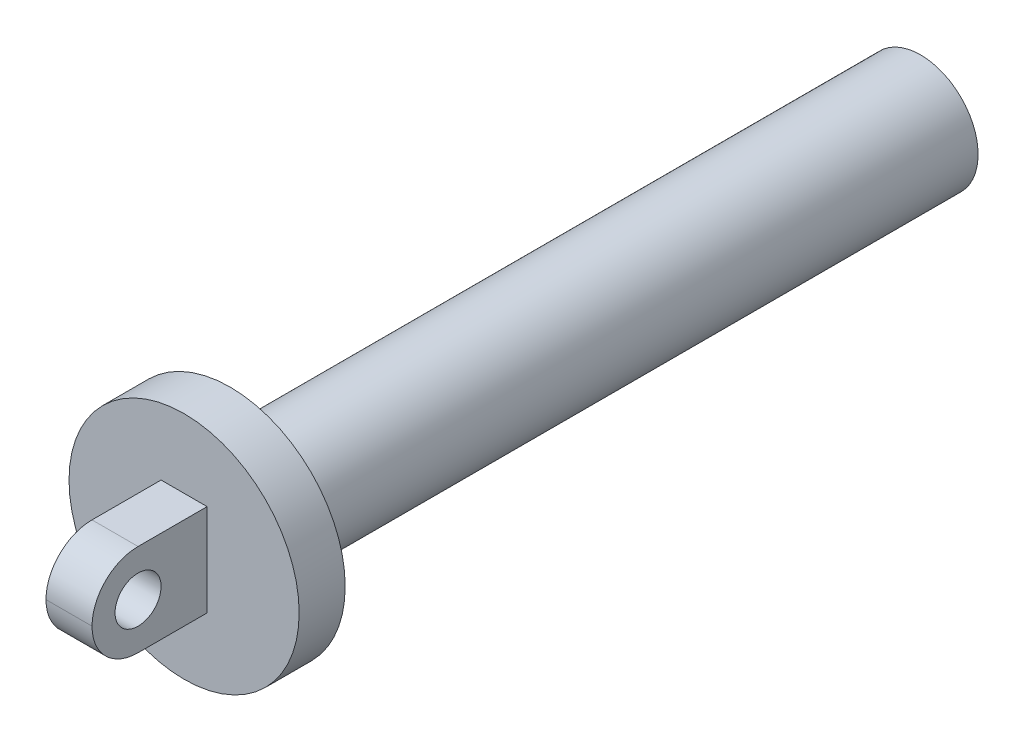
ISO-10303-21;
HEADER;
FILE_DESCRIPTION(('STEP AP214'),'2;1');
FILE_NAME('part.step','',(''),(''),'','','');
FILE_SCHEMA(('AUTOMOTIVE_DESIGN { 1 0 10303 214 1 1 1 1 }'));
ENDSEC;
DATA;
#1=APPLICATION_CONTEXT('core data for automotive mechanical design processes');
#2=APPLICATION_PROTOCOL_DEFINITION('international standard','automotive_design',2000,#1);
#3=PRODUCT_CONTEXT('',#1,'mechanical');
#4=PRODUCT('Part','Part','',(#3));
#5=PRODUCT_RELATED_PRODUCT_CATEGORY('part','',(#4));
#6=PRODUCT_DEFINITION_FORMATION('','',#4);
#7=PRODUCT_DEFINITION_CONTEXT('part definition',#1,'design');
#8=PRODUCT_DEFINITION('design','',#6,#7);
#9=PRODUCT_DEFINITION_SHAPE('','',#8);
#10=(LENGTH_UNIT() NAMED_UNIT(*) SI_UNIT(.MILLI.,.METRE.));
#11=(NAMED_UNIT(*) PLANE_ANGLE_UNIT() SI_UNIT($,.RADIAN.));
#12=(NAMED_UNIT(*) SI_UNIT($,.STERADIAN.) SOLID_ANGLE_UNIT());
#13=UNCERTAINTY_MEASURE_WITH_UNIT(LENGTH_MEASURE(1.E-05),#10,'distance_accuracy_value','');
#14=(GEOMETRIC_REPRESENTATION_CONTEXT(3) GLOBAL_UNCERTAINTY_ASSIGNED_CONTEXT((#13)) GLOBAL_UNIT_ASSIGNED_CONTEXT((#10,
#11,#12)) REPRESENTATION_CONTEXT('',''));
#15=CARTESIAN_POINT('',(0.,0.,0.));
#16=DIRECTION('',(0.,0.,1.));
#17=DIRECTION('',(1.,0.,0.));
#18=AXIS2_PLACEMENT_3D('',#15,#16,#17);
#19=CARTESIAN_POINT('',(0.,0.,10.));
#20=DIRECTION('',(0.,0.,-1.));
#21=DIRECTION('',(-1.,0.,0.));
#22=AXIS2_PLACEMENT_3D('',#19,#20,#21);
#23=CYLINDRICAL_SURFACE('',#22,25.);
#24=CARTESIAN_POINT('',(0.,0.,10.));
#25=DIRECTION('',(0.,0.,1.));
#26=DIRECTION('',(1.,0.,0.));
#27=AXIS2_PLACEMENT_3D('',#24,#25,#26);
#28=CIRCLE('',#27,25.);
#29=CARTESIAN_POINT('',(25.,0.,10.));
#30=VERTEX_POINT('',#29);
#31=EDGE_CURVE('E132',#30,#30,#28,.T.);
#32=ORIENTED_EDGE('',*,*,#31,.F.);
#33=EDGE_LOOP('',(#32));
#34=FACE_BOUND('',#33,.T.);
#35=CARTESIAN_POINT('',(0.,0.,0.));
#36=DIRECTION('',(0.,0.,1.));
#37=DIRECTION('',(1.,0.,0.));
#38=AXIS2_PLACEMENT_3D('',#35,#36,#37);
#39=CIRCLE('',#38,25.);
#40=CARTESIAN_POINT('',(25.,0.,0.));
#41=VERTEX_POINT('',#40);
#42=EDGE_CURVE('E131',#41,#41,#39,.T.);
#43=ORIENTED_EDGE('',*,*,#42,.T.);
#44=EDGE_LOOP('',(#43));
#45=FACE_BOUND('',#44,.T.);
#46=ADVANCED_FACE('F43',(#34,#45),#23,.T.);
#47=CARTESIAN_POINT('',(0.,0.,10.));
#48=DIRECTION('',(0.,0.,1.));
#49=DIRECTION('',(1.,0.,0.));
#50=AXIS2_PLACEMENT_3D('',#47,#48,#49);
#51=PLANE('',#50);
#52=DIRECTION('',(0.,1.,0.));
#53=VECTOR('',#52,1.);
#54=CARTESIAN_POINT('',(5.,10.,10.));
#55=LINE('',#54,#53);
#56=CARTESIAN_POINT('',(5.,-10.,10.));
#57=VERTEX_POINT('',#56);
#58=CARTESIAN_POINT('',(5.,10.,10.));
#59=VERTEX_POINT('',#58);
#60=EDGE_CURVE('E115',#57,#59,#55,.T.);
#61=ORIENTED_EDGE('',*,*,#60,.F.);
#62=DIRECTION('',(1.,0.,0.));
#63=VECTOR('',#62,1.);
#64=CARTESIAN_POINT('',(-5.,-10.,10.));
#65=LINE('',#64,#63);
#66=CARTESIAN_POINT('',(-5.,-10.,10.));
#67=VERTEX_POINT('',#66);
#68=EDGE_CURVE('E109',#67,#57,#65,.T.);
#69=ORIENTED_EDGE('',*,*,#68,.F.);
#70=DIRECTION('',(0.,-1.,0.));
#71=VECTOR('',#70,1.);
#72=CARTESIAN_POINT('',(-5.,10.,10.));
#73=LINE('',#72,#71);
#74=CARTESIAN_POINT('',(-5.,10.,10.));
#75=VERTEX_POINT('',#74);
#76=EDGE_CURVE('E92',#75,#67,#73,.T.);
#77=ORIENTED_EDGE('',*,*,#76,.F.);
#78=DIRECTION('',(-1.,0.,0.));
#79=VECTOR('',#78,1.);
#80=CARTESIAN_POINT('',(-5.,10.,10.));
#81=LINE('',#80,#79);
#82=EDGE_CURVE('E106',#59,#75,#81,.T.);
#83=ORIENTED_EDGE('',*,*,#82,.F.);
#84=EDGE_LOOP('',(#61,#69,#77,#83));
#85=FACE_BOUND('',#84,.T.);
#86=ORIENTED_EDGE('',*,*,#31,.T.);
#87=EDGE_LOOP('',(#86));
#88=FACE_BOUND('',#87,.T.);
#89=ADVANCED_FACE('F104',(#85,#88),#51,.T.);
#90=CARTESIAN_POINT('',(0.,0.,0.));
#91=DIRECTION('',(0.,0.,1.));
#92=DIRECTION('',(1.,0.,0.));
#93=AXIS2_PLACEMENT_3D('',#90,#91,#92);
#94=PLANE('',#93);
#95=CARTESIAN_POINT('',(0.,0.,0.));
#96=DIRECTION('',(0.,0.,-1.));
#97=DIRECTION('',(-1.,0.,0.));
#98=AXIS2_PLACEMENT_3D('',#95,#96,#97);
#99=CIRCLE('',#98,12.5);
#100=CARTESIAN_POINT('',(-12.5,0.,0.));
#101=VERTEX_POINT('',#100);
#102=EDGE_CURVE('E11',#101,#101,#99,.T.);
#103=ORIENTED_EDGE('',*,*,#102,.F.);
#104=EDGE_LOOP('',(#103));
#105=FACE_BOUND('',#104,.T.);
#106=ORIENTED_EDGE('',*,*,#42,.F.);
#107=EDGE_LOOP('',(#106));
#108=FACE_BOUND('',#107,.T.);
#109=ADVANCED_FACE('F186',(#105,#108),#94,.F.);
#110=CARTESIAN_POINT('',(5.,10.,35.));
#111=DIRECTION('',(-1.,0.,0.));
#112=DIRECTION('',(0.,-1.,0.));
#113=AXIS2_PLACEMENT_3D('',#110,#111,#112);
#114=PLANE('',#113);
#115=CARTESIAN_POINT('',(5.,0.,25.));
#116=DIRECTION('',(-1.,0.,0.));
#117=DIRECTION('',(0.,-1.,0.));
#118=AXIS2_PLACEMENT_3D('',#115,#116,#117);
#119=CIRCLE('',#118,5.);
#120=CARTESIAN_POINT('',(5.,-4.99999999999999,25.));
#121=VERTEX_POINT('',#120);
#122=EDGE_CURVE('E118',#121,#121,#119,.T.);
#123=ORIENTED_EDGE('',*,*,#122,.T.);
#124=EDGE_LOOP('',(#123));
#125=FACE_BOUND('',#124,.T.);
#126=CARTESIAN_POINT('',(5.,0.,25.));
#127=DIRECTION('',(-1.,0.,0.));
#128=DIRECTION('',(0.,-1.,0.));
#129=AXIS2_PLACEMENT_3D('',#126,#127,#128);
#130=CIRCLE('',#129,10.);
#131=CARTESIAN_POINT('',(5.,10.,25.));
#132=VERTEX_POINT('',#131);
#133=CARTESIAN_POINT('',(5.,0.,35.));
#134=VERTEX_POINT('',#133);
#135=EDGE_CURVE('E136',#132,#134,#130,.F.);
#136=ORIENTED_EDGE('',*,*,#135,.T.);
#137=CARTESIAN_POINT('',(5.,0.,25.));
#138=DIRECTION('',(-1.,0.,0.));
#139=DIRECTION('',(0.,-1.,0.));
#140=AXIS2_PLACEMENT_3D('',#137,#138,#139);
#141=CIRCLE('',#140,10.);
#142=CARTESIAN_POINT('',(5.,-10.,25.));
#143=VERTEX_POINT('',#142);
#144=EDGE_CURVE('E142',#134,#143,#141,.F.);
#145=ORIENTED_EDGE('',*,*,#144,.T.);
#146=DIRECTION('',(0.,0.,-1.));
#147=VECTOR('',#146,1.);
#148=CARTESIAN_POINT('',(5.,-10.,35.));
#149=LINE('',#148,#147);
#150=EDGE_CURVE('E124',#143,#57,#149,.T.);
#151=ORIENTED_EDGE('',*,*,#150,.T.);
#152=ORIENTED_EDGE('',*,*,#60,.T.);
#153=DIRECTION('',(0.,0.,-1.));
#154=VECTOR('',#153,1.);
#155=CARTESIAN_POINT('',(5.,10.,35.));
#156=LINE('',#155,#154);
#157=EDGE_CURVE('E97',#132,#59,#156,.T.);
#158=ORIENTED_EDGE('',*,*,#157,.F.);
#159=EDGE_LOOP('',(#136,#145,#151,#152,#158));
#160=FACE_BOUND('',#159,.T.);
#161=ADVANCED_FACE('F156',(#125,#160),#114,.F.);
#162=CARTESIAN_POINT('',(-5.,10.,35.));
#163=DIRECTION('',(0.,-1.,0.));
#164=DIRECTION('',(0.,0.,-1.));
#165=AXIS2_PLACEMENT_3D('',#162,#163,#164);
#166=PLANE('',#165);
#167=DIRECTION('',(0.,0.,-1.));
#168=VECTOR('',#167,1.);
#169=CARTESIAN_POINT('',(-5.,10.,35.));
#170=LINE('',#169,#168);
#171=CARTESIAN_POINT('',(-5.,10.,25.));
#172=VERTEX_POINT('',#171);
#173=EDGE_CURVE('E89',#172,#75,#170,.T.);
#174=ORIENTED_EDGE('',*,*,#173,.F.);
#175=DIRECTION('',(-1.,0.,0.));
#176=VECTOR('',#175,1.);
#177=CARTESIAN_POINT('',(5.,10.,25.));
#178=LINE('',#177,#176);
#179=EDGE_CURVE('E53',#172,#132,#178,.F.);
#180=ORIENTED_EDGE('',*,*,#179,.T.);
#181=ORIENTED_EDGE('',*,*,#157,.T.);
#182=ORIENTED_EDGE('',*,*,#82,.T.);
#183=EDGE_LOOP('',(#174,#180,#181,#182));
#184=FACE_BOUND('',#183,.T.);
#185=ADVANCED_FACE('F112',(#184),#166,.F.);
#186=CARTESIAN_POINT('',(-5.,10.,35.));
#187=DIRECTION('',(1.,0.,0.));
#188=DIRECTION('',(0.,1.,0.));
#189=AXIS2_PLACEMENT_3D('',#186,#187,#188);
#190=PLANE('',#189);
#191=CARTESIAN_POINT('',(-5.,0.,25.));
#192=DIRECTION('',(-1.,0.,0.));
#193=DIRECTION('',(0.,-1.,0.));
#194=AXIS2_PLACEMENT_3D('',#191,#192,#193);
#195=CIRCLE('',#194,5.);
#196=CARTESIAN_POINT('',(-5.,-5.,25.));
#197=VERTEX_POINT('',#196);
#198=EDGE_CURVE('E162',#197,#197,#195,.T.);
#199=ORIENTED_EDGE('',*,*,#198,.F.);
#200=EDGE_LOOP('',(#199));
#201=FACE_BOUND('',#200,.T.);
#202=DIRECTION('',(0.,0.,-1.));
#203=VECTOR('',#202,1.);
#204=CARTESIAN_POINT('',(-5.,-10.,35.));
#205=LINE('',#204,#203);
#206=CARTESIAN_POINT('',(-5.,-10.,25.));
#207=VERTEX_POINT('',#206);
#208=EDGE_CURVE('E98',#207,#67,#205,.T.);
#209=ORIENTED_EDGE('',*,*,#208,.F.);
#210=CARTESIAN_POINT('',(-5.,0.,25.));
#211=DIRECTION('',(1.,0.,0.));
#212=DIRECTION('',(0.,1.,0.));
#213=AXIS2_PLACEMENT_3D('',#210,#211,#212);
#214=CIRCLE('',#213,10.);
#215=CARTESIAN_POINT('',(-5.,0.,35.));
#216=VERTEX_POINT('',#215);
#217=EDGE_CURVE('E66',#207,#216,#214,.F.);
#218=ORIENTED_EDGE('',*,*,#217,.T.);
#219=CARTESIAN_POINT('',(-5.,0.,25.));
#220=DIRECTION('',(1.,0.,0.));
#221=DIRECTION('',(0.,1.,0.));
#222=AXIS2_PLACEMENT_3D('',#219,#220,#221);
#223=CIRCLE('',#222,10.);
#224=EDGE_CURVE('E61',#216,#172,#223,.F.);
#225=ORIENTED_EDGE('',*,*,#224,.T.);
#226=ORIENTED_EDGE('',*,*,#173,.T.);
#227=ORIENTED_EDGE('',*,*,#76,.T.);
#228=EDGE_LOOP('',(#209,#218,#225,#226,#227));
#229=FACE_BOUND('',#228,.T.);
#230=ADVANCED_FACE('F91',(#201,#229),#190,.F.);
#231=CARTESIAN_POINT('',(-5.,-10.,35.));
#232=DIRECTION('',(0.,1.,0.));
#233=DIRECTION('',(0.,0.,1.));
#234=AXIS2_PLACEMENT_3D('',#231,#232,#233);
#235=PLANE('',#234);
#236=ORIENTED_EDGE('',*,*,#150,.F.);
#237=DIRECTION('',(1.,0.,0.));
#238=VECTOR('',#237,1.);
#239=CARTESIAN_POINT('',(-5.,-10.,25.));
#240=LINE('',#239,#238);
#241=EDGE_CURVE('E145',#143,#207,#240,.F.);
#242=ORIENTED_EDGE('',*,*,#241,.T.);
#243=ORIENTED_EDGE('',*,*,#208,.T.);
#244=ORIENTED_EDGE('',*,*,#68,.T.);
#245=EDGE_LOOP('',(#236,#242,#243,#244));
#246=FACE_BOUND('',#245,.T.);
#247=ADVANCED_FACE('F168',(#246),#235,.F.);
#248=CARTESIAN_POINT('',(15.,0.,25.));
#249=DIRECTION('',(-1.,0.,0.));
#250=DIRECTION('',(0.,-1.,0.));
#251=AXIS2_PLACEMENT_3D('',#248,#249,#250);
#252=CYLINDRICAL_SURFACE('',#251,5.);
#253=ORIENTED_EDGE('',*,*,#198,.T.);
#254=EDGE_LOOP('',(#253));
#255=FACE_BOUND('',#254,.T.);
#256=ORIENTED_EDGE('',*,*,#122,.F.);
#257=EDGE_LOOP('',(#256));
#258=FACE_BOUND('',#257,.T.);
#259=ADVANCED_FACE('F170',(#255,#258),#252,.F.);
#260=CARTESIAN_POINT('',(0.,0.,25.));
#261=DIRECTION('',(1.,0.,0.));
#262=DIRECTION('',(0.,0.,-1.));
#263=AXIS2_PLACEMENT_3D('',#260,#261,#262);
#264=CYLINDRICAL_SURFACE('',#263,10.);
#265=ORIENTED_EDGE('',*,*,#179,.F.);
#266=ORIENTED_EDGE('',*,*,#224,.F.);
#267=DIRECTION('',(-1.,0.,0.));
#268=VECTOR('',#267,1.);
#269=CARTESIAN_POINT('',(-5.,0.,35.));
#270=LINE('',#269,#268);
#271=EDGE_CURVE('E47',#134,#216,#270,.T.);
#272=ORIENTED_EDGE('',*,*,#271,.F.);
#273=ORIENTED_EDGE('',*,*,#135,.F.);
#274=EDGE_LOOP('',(#265,#266,#272,#273));
#275=FACE_BOUND('',#274,.T.);
#276=ADVANCED_FACE('F45',(#275),#264,.T.);
#277=CARTESIAN_POINT('',(0.,0.,25.));
#278=DIRECTION('',(-1.,0.,0.));
#279=DIRECTION('',(0.,0.,1.));
#280=AXIS2_PLACEMENT_3D('',#277,#278,#279);
#281=CYLINDRICAL_SURFACE('',#280,10.);
#282=ORIENTED_EDGE('',*,*,#217,.F.);
#283=ORIENTED_EDGE('',*,*,#241,.F.);
#284=ORIENTED_EDGE('',*,*,#144,.F.);
#285=ORIENTED_EDGE('',*,*,#271,.T.);
#286=EDGE_LOOP('',(#282,#283,#284,#285));
#287=FACE_BOUND('',#286,.T.);
#288=ADVANCED_FACE('F165',(#287),#281,.T.);
#289=CARTESIAN_POINT('',(0.,0.,-150.));
#290=DIRECTION('',(0.,0.,1.));
#291=DIRECTION('',(1.,0.,0.));
#292=AXIS2_PLACEMENT_3D('',#289,#290,#291);
#293=CYLINDRICAL_SURFACE('',#292,12.5);
#294=CARTESIAN_POINT('',(0.,0.,-150.));
#295=DIRECTION('',(0.,0.,-1.));
#296=DIRECTION('',(-1.,0.,0.));
#297=AXIS2_PLACEMENT_3D('',#294,#295,#296);
#298=CIRCLE('',#297,12.5);
#299=CARTESIAN_POINT('',(-12.5,0.,-150.));
#300=VERTEX_POINT('',#299);
#301=EDGE_CURVE('E163',#300,#300,#298,.T.);
#302=ORIENTED_EDGE('',*,*,#301,.F.);
#303=EDGE_LOOP('',(#302));
#304=FACE_BOUND('',#303,.T.);
#305=ORIENTED_EDGE('',*,*,#102,.T.);
#306=EDGE_LOOP('',(#305));
#307=FACE_BOUND('',#306,.T.);
#308=ADVANCED_FACE('F192',(#304,#307),#293,.T.);
#309=CARTESIAN_POINT('',(0.,0.,-150.));
#310=DIRECTION('',(0.,0.,-1.));
#311=DIRECTION('',(-1.,0.,0.));
#312=AXIS2_PLACEMENT_3D('',#309,#310,#311);
#313=PLANE('',#312);
#314=ORIENTED_EDGE('',*,*,#301,.T.);
#315=EDGE_LOOP('',(#314));
#316=FACE_BOUND('',#315,.T.);
#317=ADVANCED_FACE('F197',(#316),#313,.T.);
#318=CLOSED_SHELL('',(#46,#89,#109,#161,#185,#230,#247,#259,#276,#288,#308,#317));
#319=MANIFOLD_SOLID_BREP('B2',#318);
#320=ADVANCED_BREP_SHAPE_REPRESENTATION('',(#18,#319),#14);
#321=SHAPE_DEFINITION_REPRESENTATION(#9,#320);
ENDSEC;
END-ISO-10303-21;
